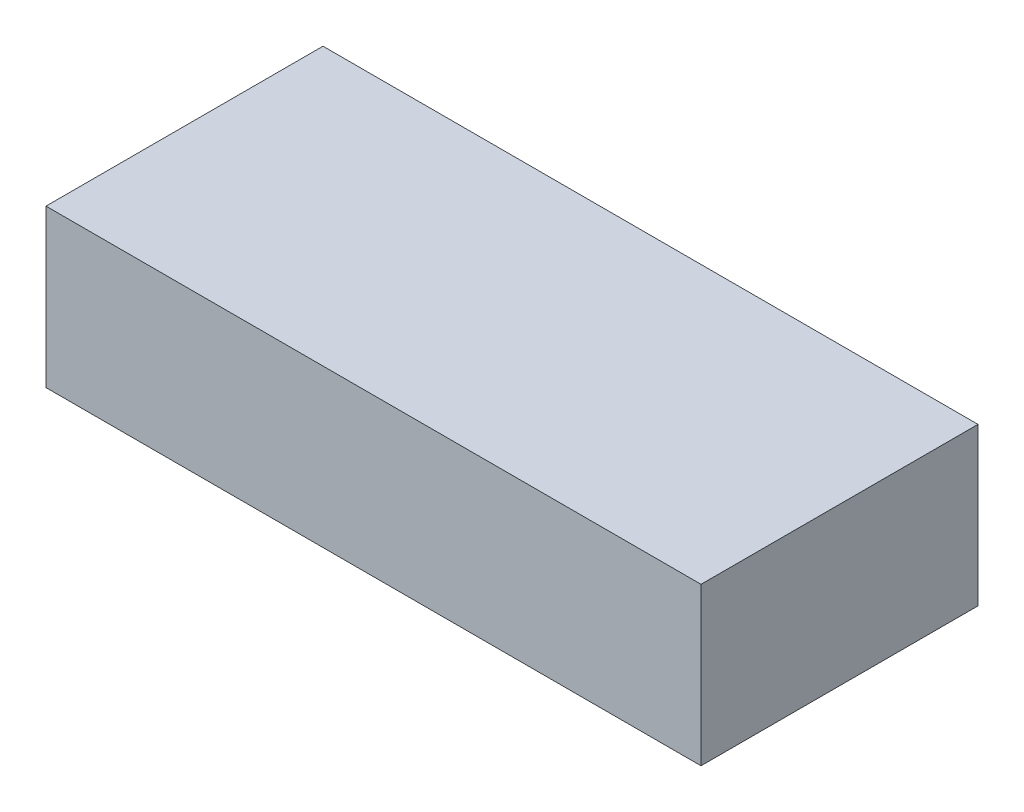
ISO-10303-21;
HEADER;
FILE_DESCRIPTION(('STEP AP214'),'2;1');
FILE_NAME('part.step','',(''),(''),'','','');
FILE_SCHEMA(('AUTOMOTIVE_DESIGN { 1 0 10303 214 1 1 1 1 }'));
ENDSEC;
DATA;
#1=APPLICATION_CONTEXT('core data for automotive mechanical design processes');
#2=APPLICATION_PROTOCOL_DEFINITION('international standard','automotive_design',2000,#1);
#3=PRODUCT_CONTEXT('',#1,'mechanical');
#4=PRODUCT('Part','Part','',(#3));
#5=PRODUCT_RELATED_PRODUCT_CATEGORY('part','',(#4));
#6=PRODUCT_DEFINITION_FORMATION('','',#4);
#7=PRODUCT_DEFINITION_CONTEXT('part definition',#1,'design');
#8=PRODUCT_DEFINITION('design','',#6,#7);
#9=PRODUCT_DEFINITION_SHAPE('','',#8);
#10=(LENGTH_UNIT() NAMED_UNIT(*) SI_UNIT(.MILLI.,.METRE.));
#11=(NAMED_UNIT(*) PLANE_ANGLE_UNIT() SI_UNIT($,.RADIAN.));
#12=(NAMED_UNIT(*) SI_UNIT($,.STERADIAN.) SOLID_ANGLE_UNIT());
#13=UNCERTAINTY_MEASURE_WITH_UNIT(LENGTH_MEASURE(1.E-05),#10,'distance_accuracy_value','');
#14=(GEOMETRIC_REPRESENTATION_CONTEXT(3) GLOBAL_UNCERTAINTY_ASSIGNED_CONTEXT((#13)) GLOBAL_UNIT_ASSIGNED_CONTEXT((#10,
#11,#12)) REPRESENTATION_CONTEXT('',''));
#15=CARTESIAN_POINT('',(0.,0.,0.));
#16=DIRECTION('',(0.,0.,1.));
#17=DIRECTION('',(1.,0.,0.));
#18=AXIS2_PLACEMENT_3D('',#15,#16,#17);
#19=CARTESIAN_POINT('',(437.5,-210.,1.09605888523688E-13));
#20=DIRECTION('',(1.,0.,0.));
#21=DIRECTION('',(0.,0.,-1.));
#22=AXIS2_PLACEMENT_3D('',#19,#20,#21);
#23=PLANE('',#22);
#24=DIRECTION('',(0.,0.,-1.));
#25=VECTOR('',#24,1.);
#26=CARTESIAN_POINT('',(437.5,0.,1.09605888523688E-13));
#27=LINE('',#26,#25);
#28=CARTESIAN_POINT('',(437.5,0.,1.09605888523688E-13));
#29=VERTEX_POINT('',#28);
#30=CARTESIAN_POINT('',(437.5,0.,-370.));
#31=VERTEX_POINT('',#30);
#32=EDGE_CURVE('E99',#29,#31,#27,.T.);
#33=ORIENTED_EDGE('',*,*,#32,.F.);
#34=DIRECTION('',(0.,1.,0.));
#35=VECTOR('',#34,1.);
#36=CARTESIAN_POINT('',(437.5,-210.,1.09605888523688E-13));
#37=LINE('',#36,#35);
#38=CARTESIAN_POINT('',(437.5,-210.,1.09605888523688E-13));
#39=VERTEX_POINT('',#38);
#40=EDGE_CURVE('E11',#39,#29,#37,.T.);
#41=ORIENTED_EDGE('',*,*,#40,.F.);
#42=DIRECTION('',(0.,0.,-1.));
#43=VECTOR('',#42,1.);
#44=CARTESIAN_POINT('',(437.5,-210.,1.09605888523688E-13));
#45=LINE('',#44,#43);
#46=CARTESIAN_POINT('',(437.5,-210.,-370.));
#47=VERTEX_POINT('',#46);
#48=EDGE_CURVE('E93',#39,#47,#45,.T.);
#49=ORIENTED_EDGE('',*,*,#48,.T.);
#50=DIRECTION('',(0.,1.,0.));
#51=VECTOR('',#50,1.);
#52=CARTESIAN_POINT('',(437.5,-210.,-370.));
#53=LINE('',#52,#51);
#54=EDGE_CURVE('E38',#47,#31,#53,.T.);
#55=ORIENTED_EDGE('',*,*,#54,.T.);
#56=EDGE_LOOP('',(#33,#41,#49,#55));
#57=FACE_BOUND('',#56,.T.);
#58=ADVANCED_FACE('F35',(#57),#23,.T.);
#59=CARTESIAN_POINT('',(437.5,-210.,1.09605888523688E-13));
#60=DIRECTION('',(0.,0.,1.));
#61=DIRECTION('',(1.,0.,0.));
#62=AXIS2_PLACEMENT_3D('',#59,#60,#61);
#63=PLANE('',#62);
#64=DIRECTION('',(1.,0.,0.));
#65=VECTOR('',#64,1.);
#66=CARTESIAN_POINT('',(437.5,0.,1.09605888523688E-13));
#67=LINE('',#66,#65);
#68=CARTESIAN_POINT('',(-437.5,0.,1.09605888523688E-13));
#69=VERTEX_POINT('',#68);
#70=EDGE_CURVE('E95',#69,#29,#67,.T.);
#71=ORIENTED_EDGE('',*,*,#70,.F.);
#72=DIRECTION('',(0.,1.,0.));
#73=VECTOR('',#72,1.);
#74=CARTESIAN_POINT('',(-437.5,-210.,1.09605888523688E-13));
#75=LINE('',#74,#73);
#76=CARTESIAN_POINT('',(-437.5,-210.,1.09605888523688E-13));
#77=VERTEX_POINT('',#76);
#78=EDGE_CURVE('E44',#77,#69,#75,.T.);
#79=ORIENTED_EDGE('',*,*,#78,.F.);
#80=DIRECTION('',(1.,0.,0.));
#81=VECTOR('',#80,1.);
#82=CARTESIAN_POINT('',(437.5,-210.,1.09605888523688E-13));
#83=LINE('',#82,#81);
#84=EDGE_CURVE('E90',#77,#39,#83,.T.);
#85=ORIENTED_EDGE('',*,*,#84,.T.);
#86=ORIENTED_EDGE('',*,*,#40,.T.);
#87=EDGE_LOOP('',(#71,#79,#85,#86));
#88=FACE_BOUND('',#87,.T.);
#89=ADVANCED_FACE('F109',(#88),#63,.T.);
#90=CARTESIAN_POINT('',(-437.5,-210.,1.09605888523688E-13));
#91=DIRECTION('',(-1.,0.,0.));
#92=DIRECTION('',(0.,0.,1.));
#93=AXIS2_PLACEMENT_3D('',#90,#91,#92);
#94=PLANE('',#93);
#95=DIRECTION('',(0.,0.,1.));
#96=VECTOR('',#95,1.);
#97=CARTESIAN_POINT('',(-437.5,0.,1.09605888523688E-13));
#98=LINE('',#97,#96);
#99=CARTESIAN_POINT('',(-437.5,0.,-370.));
#100=VERTEX_POINT('',#99);
#101=EDGE_CURVE('E85',#100,#69,#98,.T.);
#102=ORIENTED_EDGE('',*,*,#101,.F.);
#103=DIRECTION('',(0.,1.,0.));
#104=VECTOR('',#103,1.);
#105=CARTESIAN_POINT('',(-437.5,-210.,-370.));
#106=LINE('',#105,#104);
#107=CARTESIAN_POINT('',(-437.5,-210.,-370.));
#108=VERTEX_POINT('',#107);
#109=EDGE_CURVE('E80',#108,#100,#106,.T.);
#110=ORIENTED_EDGE('',*,*,#109,.F.);
#111=DIRECTION('',(0.,0.,1.));
#112=VECTOR('',#111,1.);
#113=CARTESIAN_POINT('',(-437.5,-210.,1.09605888523688E-13));
#114=LINE('',#113,#112);
#115=EDGE_CURVE('E83',#108,#77,#114,.T.);
#116=ORIENTED_EDGE('',*,*,#115,.T.);
#117=ORIENTED_EDGE('',*,*,#78,.T.);
#118=EDGE_LOOP('',(#102,#110,#116,#117));
#119=FACE_BOUND('',#118,.T.);
#120=ADVANCED_FACE('F82',(#119),#94,.T.);
#121=CARTESIAN_POINT('',(437.5,-210.,-370.));
#122=DIRECTION('',(0.,0.,-1.));
#123=DIRECTION('',(-1.,0.,0.));
#124=AXIS2_PLACEMENT_3D('',#121,#122,#123);
#125=PLANE('',#124);
#126=DIRECTION('',(-1.,0.,0.));
#127=VECTOR('',#126,1.);
#128=CARTESIAN_POINT('',(437.5,0.,-370.));
#129=LINE('',#128,#127);
#130=EDGE_CURVE('E102',#31,#100,#129,.T.);
#131=ORIENTED_EDGE('',*,*,#130,.F.);
#132=ORIENTED_EDGE('',*,*,#54,.F.);
#133=DIRECTION('',(-1.,0.,0.));
#134=VECTOR('',#133,1.);
#135=CARTESIAN_POINT('',(437.5,-210.,-370.));
#136=LINE('',#135,#134);
#137=EDGE_CURVE('E89',#47,#108,#136,.T.);
#138=ORIENTED_EDGE('',*,*,#137,.T.);
#139=ORIENTED_EDGE('',*,*,#109,.T.);
#140=EDGE_LOOP('',(#131,#132,#138,#139));
#141=FACE_BOUND('',#140,.T.);
#142=ADVANCED_FACE('F92',(#141),#125,.T.);
#143=CARTESIAN_POINT('',(0.,-210.,0.));
#144=DIRECTION('',(0.,1.,0.));
#145=DIRECTION('',(0.,0.,1.));
#146=AXIS2_PLACEMENT_3D('',#143,#144,#145);
#147=PLANE('',#146);
#148=ORIENTED_EDGE('',*,*,#48,.F.);
#149=ORIENTED_EDGE('',*,*,#84,.F.);
#150=ORIENTED_EDGE('',*,*,#115,.F.);
#151=ORIENTED_EDGE('',*,*,#137,.F.);
#152=EDGE_LOOP('',(#148,#149,#150,#151));
#153=FACE_BOUND('',#152,.T.);
#154=ADVANCED_FACE('F88',(#153),#147,.F.);
#155=CARTESIAN_POINT('',(0.,0.,0.));
#156=DIRECTION('',(0.,1.,0.));
#157=DIRECTION('',(0.,0.,1.));
#158=AXIS2_PLACEMENT_3D('',#155,#156,#157);
#159=PLANE('',#158);
#160=ORIENTED_EDGE('',*,*,#32,.T.);
#161=ORIENTED_EDGE('',*,*,#130,.T.);
#162=ORIENTED_EDGE('',*,*,#101,.T.);
#163=ORIENTED_EDGE('',*,*,#70,.T.);
#164=EDGE_LOOP('',(#160,#161,#162,#163));
#165=FACE_BOUND('',#164,.T.);
#166=ADVANCED_FACE('F108',(#165),#159,.T.);
#167=CLOSED_SHELL('',(#58,#89,#120,#142,#154,#166));
#168=MANIFOLD_SOLID_BREP('B2',#167);
#169=ADVANCED_BREP_SHAPE_REPRESENTATION('',(#18,#168),#14);
#170=SHAPE_DEFINITION_REPRESENTATION(#9,#169);
ENDSEC;
END-ISO-10303-21;
